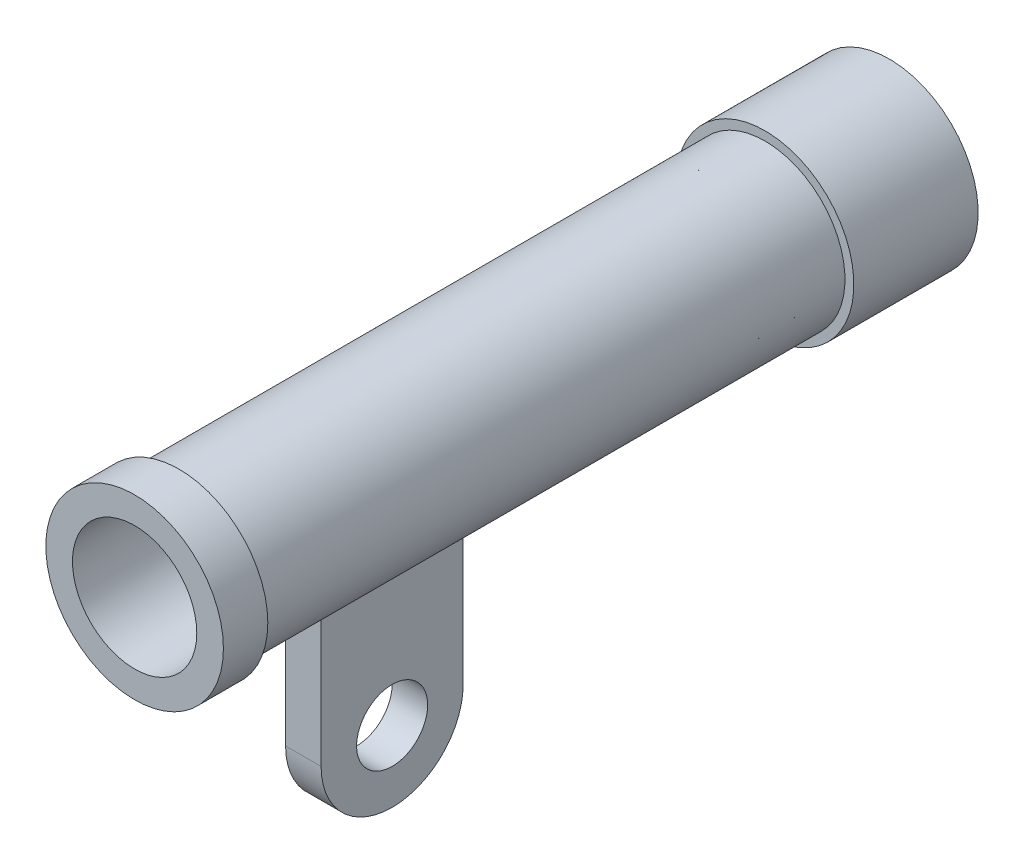
ISO-10303-21;
HEADER;
FILE_DESCRIPTION(('STEP AP214'),'2;1');
FILE_NAME('part.step','',(''),(''),'','','');
FILE_SCHEMA(('AUTOMOTIVE_DESIGN { 1 0 10303 214 1 1 1 1 }'));
ENDSEC;
DATA;
#1=APPLICATION_CONTEXT('core data for automotive mechanical design processes');
#2=APPLICATION_PROTOCOL_DEFINITION('international standard','automotive_design',2000,#1);
#3=PRODUCT_CONTEXT('',#1,'mechanical');
#4=PRODUCT('Part','Part','',(#3));
#5=PRODUCT_RELATED_PRODUCT_CATEGORY('part','',(#4));
#6=PRODUCT_DEFINITION_FORMATION('','',#4);
#7=PRODUCT_DEFINITION_CONTEXT('part definition',#1,'design');
#8=PRODUCT_DEFINITION('design','',#6,#7);
#9=PRODUCT_DEFINITION_SHAPE('','',#8);
#10=(LENGTH_UNIT() NAMED_UNIT(*) SI_UNIT(.MILLI.,.METRE.));
#11=(NAMED_UNIT(*) PLANE_ANGLE_UNIT() SI_UNIT($,.RADIAN.));
#12=(NAMED_UNIT(*) SI_UNIT($,.STERADIAN.) SOLID_ANGLE_UNIT());
#13=UNCERTAINTY_MEASURE_WITH_UNIT(LENGTH_MEASURE(1.E-05),#10,'distance_accuracy_value','');
#14=(GEOMETRIC_REPRESENTATION_CONTEXT(3) GLOBAL_UNCERTAINTY_ASSIGNED_CONTEXT((#13)) GLOBAL_UNIT_ASSIGNED_CONTEXT((#10,
#11,#12)) REPRESENTATION_CONTEXT('',''));
#15=CARTESIAN_POINT('',(0.,0.,0.));
#16=DIRECTION('',(0.,0.,1.));
#17=DIRECTION('',(1.,0.,0.));
#18=AXIS2_PLACEMENT_3D('',#15,#16,#17);
#19=CARTESIAN_POINT('',(10.,-125.,290.));
#20=DIRECTION('',(1.,0.,0.));
#21=DIRECTION('',(0.,0.,-1.));
#22=AXIS2_PLACEMENT_3D('',#19,#20,#21);
#23=PLANE('',#22);
#24=DIRECTION('',(0.,0.,1.));
#25=VECTOR('',#24,1.);
#26=CARTESIAN_POINT('',(10.,-45.,330.));
#27=LINE('',#26,#25);
#28=CARTESIAN_POINT('',(10.,-45.,250.));
#29=VERTEX_POINT('',#28);
#30=CARTESIAN_POINT('',(10.,-45.,330.));
#31=VERTEX_POINT('',#30);
#32=EDGE_CURVE('E92',#29,#31,#27,.T.);
#33=ORIENTED_EDGE('',*,*,#32,.T.);
#34=DIRECTION('',(0.,-1.,0.));
#35=VECTOR('',#34,1.);
#36=CARTESIAN_POINT('',(10.,-45.,330.));
#37=LINE('',#36,#35);
#38=CARTESIAN_POINT('',(10.,-125.,330.));
#39=VERTEX_POINT('',#38);
#40=EDGE_CURVE('E87',#31,#39,#37,.T.);
#41=ORIENTED_EDGE('',*,*,#40,.T.);
#42=CARTESIAN_POINT('',(10.,-125.,290.));
#43=DIRECTION('',(1.,0.,0.));
#44=DIRECTION('',(0.,0.,-1.));
#45=AXIS2_PLACEMENT_3D('',#42,#43,#44);
#46=CIRCLE('',#45,40.);
#47=CARTESIAN_POINT('',(10.,-125.,250.));
#48=VERTEX_POINT('',#47);
#49=EDGE_CURVE('E90',#39,#48,#46,.T.);
#50=ORIENTED_EDGE('',*,*,#49,.T.);
#51=DIRECTION('',(0.,1.,0.));
#52=VECTOR('',#51,1.);
#53=CARTESIAN_POINT('',(10.,-125.,250.));
#54=LINE('',#53,#52);
#55=EDGE_CURVE('E57',#48,#29,#54,.T.);
#56=ORIENTED_EDGE('',*,*,#55,.T.);
#57=EDGE_LOOP('',(#33,#41,#50,#56));
#58=FACE_BOUND('',#57,.T.);
#59=CARTESIAN_POINT('',(10.,-125.,290.));
#60=DIRECTION('',(1.,0.,0.));
#61=DIRECTION('',(0.,0.,-1.));
#62=AXIS2_PLACEMENT_3D('',#59,#60,#61);
#63=CIRCLE('',#62,20.);
#64=CARTESIAN_POINT('',(10.,-125.,270.));
#65=VERTEX_POINT('',#64);
#66=EDGE_CURVE('E107',#65,#65,#63,.T.);
#67=ORIENTED_EDGE('',*,*,#66,.F.);
#68=EDGE_LOOP('',(#67));
#69=FACE_BOUND('',#68,.T.);
#70=ADVANCED_FACE('F40',(#58,#69),#23,.T.);
#71=CARTESIAN_POINT('',(-10.,-125.,290.));
#72=DIRECTION('',(1.,0.,0.));
#73=DIRECTION('',(0.,0.,-1.));
#74=AXIS2_PLACEMENT_3D('',#71,#72,#73);
#75=PLANE('',#74);
#76=DIRECTION('',(0.,0.,1.));
#77=VECTOR('',#76,1.);
#78=CARTESIAN_POINT('',(-10.,-45.,330.));
#79=LINE('',#78,#77);
#80=CARTESIAN_POINT('',(-10.,-45.,250.));
#81=VERTEX_POINT('',#80);
#82=CARTESIAN_POINT('',(-10.,-45.,330.));
#83=VERTEX_POINT('',#82);
#84=EDGE_CURVE('E104',#81,#83,#79,.T.);
#85=ORIENTED_EDGE('',*,*,#84,.F.);
#86=DIRECTION('',(0.,1.,0.));
#87=VECTOR('',#86,1.);
#88=CARTESIAN_POINT('',(-10.,-125.,250.));
#89=LINE('',#88,#87);
#90=CARTESIAN_POINT('',(-10.,-125.,250.));
#91=VERTEX_POINT('',#90);
#92=EDGE_CURVE('E80',#91,#81,#89,.T.);
#93=ORIENTED_EDGE('',*,*,#92,.F.);
#94=CARTESIAN_POINT('',(-10.,-125.,290.));
#95=DIRECTION('',(1.,0.,0.));
#96=DIRECTION('',(0.,0.,-1.));
#97=AXIS2_PLACEMENT_3D('',#94,#95,#96);
#98=CIRCLE('',#97,40.);
#99=CARTESIAN_POINT('',(-10.,-125.,330.));
#100=VERTEX_POINT('',#99);
#101=EDGE_CURVE('E74',#100,#91,#98,.T.);
#102=ORIENTED_EDGE('',*,*,#101,.F.);
#103=DIRECTION('',(0.,-1.,0.));
#104=VECTOR('',#103,1.);
#105=CARTESIAN_POINT('',(-10.,-45.,330.));
#106=LINE('',#105,#104);
#107=EDGE_CURVE('E96',#83,#100,#106,.T.);
#108=ORIENTED_EDGE('',*,*,#107,.F.);
#109=EDGE_LOOP('',(#85,#93,#102,#108));
#110=FACE_BOUND('',#109,.T.);
#111=CARTESIAN_POINT('',(-10.,-125.,290.));
#112=DIRECTION('',(1.,0.,0.));
#113=DIRECTION('',(0.,0.,-1.));
#114=AXIS2_PLACEMENT_3D('',#111,#112,#113);
#115=CIRCLE('',#114,20.);
#116=CARTESIAN_POINT('',(-10.,-125.,270.));
#117=VERTEX_POINT('',#116);
#118=EDGE_CURVE('E119',#117,#117,#115,.T.);
#119=ORIENTED_EDGE('',*,*,#118,.T.);
#120=EDGE_LOOP('',(#119));
#121=FACE_BOUND('',#120,.T.);
#122=ADVANCED_FACE('F115',(#110,#121),#75,.F.);
#123=CARTESIAN_POINT('',(10.,-45.,330.));
#124=DIRECTION('',(0.,-1.,0.));
#125=DIRECTION('',(0.,0.,-1.));
#126=AXIS2_PLACEMENT_3D('',#123,#124,#125);
#127=PLANE('',#126);
#128=ORIENTED_EDGE('',*,*,#84,.T.);
#129=DIRECTION('',(-1.,0.,0.));
#130=VECTOR('',#129,1.);
#131=CARTESIAN_POINT('',(10.,-45.,330.));
#132=LINE('',#131,#130);
#133=EDGE_CURVE('E12',#31,#83,#132,.T.);
#134=ORIENTED_EDGE('',*,*,#133,.F.);
#135=ORIENTED_EDGE('',*,*,#32,.F.);
#136=DIRECTION('',(-1.,0.,0.));
#137=VECTOR('',#136,1.);
#138=CARTESIAN_POINT('',(10.,-45.,250.));
#139=LINE('',#138,#137);
#140=EDGE_CURVE('E100',#29,#81,#139,.T.);
#141=ORIENTED_EDGE('',*,*,#140,.T.);
#142=EDGE_LOOP('',(#128,#134,#135,#141));
#143=FACE_BOUND('',#142,.T.);
#144=ADVANCED_FACE('F42',(#143),#127,.F.);
#145=CARTESIAN_POINT('',(10.,-45.,330.));
#146=DIRECTION('',(0.,0.,-1.));
#147=DIRECTION('',(0.,1.,0.));
#148=AXIS2_PLACEMENT_3D('',#145,#146,#147);
#149=PLANE('',#148);
#150=ORIENTED_EDGE('',*,*,#107,.T.);
#151=DIRECTION('',(-1.,0.,0.));
#152=VECTOR('',#151,1.);
#153=CARTESIAN_POINT('',(10.,-125.,330.));
#154=LINE('',#153,#152);
#155=EDGE_CURVE('E49',#39,#100,#154,.T.);
#156=ORIENTED_EDGE('',*,*,#155,.F.);
#157=ORIENTED_EDGE('',*,*,#40,.F.);
#158=ORIENTED_EDGE('',*,*,#133,.T.);
#159=EDGE_LOOP('',(#150,#156,#157,#158));
#160=FACE_BOUND('',#159,.T.);
#161=ADVANCED_FACE('F95',(#160),#149,.F.);
#162=CARTESIAN_POINT('',(10.,-125.,290.));
#163=DIRECTION('',(-1.,0.,0.));
#164=DIRECTION('',(0.,0.,1.));
#165=AXIS2_PLACEMENT_3D('',#162,#163,#164);
#166=CYLINDRICAL_SURFACE('',#165,40.);
#167=ORIENTED_EDGE('',*,*,#101,.T.);
#168=DIRECTION('',(-1.,0.,0.));
#169=VECTOR('',#168,1.);
#170=CARTESIAN_POINT('',(10.,-125.,250.));
#171=LINE('',#170,#169);
#172=EDGE_CURVE('E97',#48,#91,#171,.T.);
#173=ORIENTED_EDGE('',*,*,#172,.F.);
#174=ORIENTED_EDGE('',*,*,#49,.F.);
#175=ORIENTED_EDGE('',*,*,#155,.T.);
#176=EDGE_LOOP('',(#167,#173,#174,#175));
#177=FACE_BOUND('',#176,.T.);
#178=ADVANCED_FACE('F98',(#177),#166,.T.);
#179=CARTESIAN_POINT('',(10.,-125.,250.));
#180=DIRECTION('',(0.,0.,1.));
#181=DIRECTION('',(1.,0.,0.));
#182=AXIS2_PLACEMENT_3D('',#179,#180,#181);
#183=PLANE('',#182);
#184=ORIENTED_EDGE('',*,*,#92,.T.);
#185=ORIENTED_EDGE('',*,*,#140,.F.);
#186=ORIENTED_EDGE('',*,*,#55,.F.);
#187=ORIENTED_EDGE('',*,*,#172,.T.);
#188=EDGE_LOOP('',(#184,#185,#186,#187));
#189=FACE_BOUND('',#188,.T.);
#190=ADVANCED_FACE('F112',(#189),#183,.F.);
#191=CARTESIAN_POINT('',(10.,-125.,290.));
#192=DIRECTION('',(-1.,0.,0.));
#193=DIRECTION('',(0.,0.,1.));
#194=AXIS2_PLACEMENT_3D('',#191,#192,#193);
#195=CYLINDRICAL_SURFACE('',#194,20.);
#196=ORIENTED_EDGE('',*,*,#66,.T.);
#197=EDGE_LOOP('',(#196));
#198=FACE_BOUND('',#197,.T.);
#199=ORIENTED_EDGE('',*,*,#118,.F.);
#200=EDGE_LOOP('',(#199));
#201=FACE_BOUND('',#200,.T.);
#202=ADVANCED_FACE('F125',(#198,#201),#195,.F.);
#203=CLOSED_SHELL('',(#70,#122,#144,#161,#178,#190,#202));
#204=MANIFOLD_SOLID_BREP('B2',#203);
#205=CARTESIAN_POINT('',(0.,0.,400.));
#206=DIRECTION('',(0.,0.,-1.));
#207=DIRECTION('',(-1.,0.,0.));
#208=AXIS2_PLACEMENT_3D('',#205,#206,#207);
#209=CYLINDRICAL_SURFACE('',#208,45.);
#210=CARTESIAN_POINT('',(0.,0.,400.));
#211=DIRECTION('',(0.,0.,1.));
#212=DIRECTION('',(1.,0.,0.));
#213=AXIS2_PLACEMENT_3D('',#210,#211,#212);
#214=CIRCLE('',#213,45.);
#215=CARTESIAN_POINT('',(45.,0.,400.));
#216=VERTEX_POINT('',#215);
#217=EDGE_CURVE('E195',#216,#216,#214,.T.);
#218=ORIENTED_EDGE('',*,*,#217,.F.);
#219=EDGE_LOOP('',(#218));
#220=FACE_BOUND('',#219,.T.);
#221=CARTESIAN_POINT('',(0.,0.,70.));
#222=DIRECTION('',(0.,0.,-1.));
#223=DIRECTION('',(-1.,0.,0.));
#224=AXIS2_PLACEMENT_3D('',#221,#222,#223);
#225=CIRCLE('',#224,45.);
#226=CARTESIAN_POINT('',(-45.,0.,70.));
#227=VERTEX_POINT('',#226);
#228=EDGE_CURVE('E39',#227,#227,#225,.T.);
#229=ORIENTED_EDGE('',*,*,#228,.F.);
#230=EDGE_LOOP('',(#229));
#231=FACE_BOUND('',#230,.T.);
#232=ADVANCED_FACE('F184',(#220,#231),#209,.T.);
#233=CARTESIAN_POINT('',(0.,0.,70.));
#234=DIRECTION('',(0.,0.,-1.));
#235=DIRECTION('',(-1.,0.,0.));
#236=AXIS2_PLACEMENT_3D('',#233,#234,#235);
#237=PLANE('',#236);
#238=CARTESIAN_POINT('',(0.,0.,70.));
#239=DIRECTION('',(0.,0.,-1.));
#240=DIRECTION('',(-1.,0.,0.));
#241=AXIS2_PLACEMENT_3D('',#238,#239,#240);
#242=CIRCLE('',#241,50.);
#243=CARTESIAN_POINT('',(-50.,0.,70.));
#244=VERTEX_POINT('',#243);
#245=EDGE_CURVE('E200',#244,#244,#242,.T.);
#246=ORIENTED_EDGE('',*,*,#245,.F.);
#247=EDGE_LOOP('',(#246));
#248=FACE_BOUND('',#247,.T.);
#249=ORIENTED_EDGE('',*,*,#228,.T.);
#250=EDGE_LOOP('',(#249));
#251=FACE_BOUND('',#250,.T.);
#252=ADVANCED_FACE('F237',(#248,#251),#237,.F.);
#253=CARTESIAN_POINT('',(0.,0.,70.));
#254=DIRECTION('',(0.,0.,-1.));
#255=DIRECTION('',(-1.,0.,0.));
#256=AXIS2_PLACEMENT_3D('',#253,#254,#255);
#257=CYLINDRICAL_SURFACE('',#256,50.);
#258=ORIENTED_EDGE('',*,*,#245,.T.);
#259=EDGE_LOOP('',(#258));
#260=FACE_BOUND('',#259,.T.);
#261=CARTESIAN_POINT('',(0.,0.,0.));
#262=DIRECTION('',(0.,0.,-1.));
#263=DIRECTION('',(-1.,0.,0.));
#264=AXIS2_PLACEMENT_3D('',#261,#262,#263);
#265=CIRCLE('',#264,50.);
#266=CARTESIAN_POINT('',(-50.,0.,0.));
#267=VERTEX_POINT('',#266);
#268=EDGE_CURVE('E197',#267,#267,#265,.T.);
#269=ORIENTED_EDGE('',*,*,#268,.F.);
#270=EDGE_LOOP('',(#269));
#271=FACE_BOUND('',#270,.T.);
#272=ADVANCED_FACE('F242',(#260,#271),#257,.T.);
#273=CARTESIAN_POINT('',(0.,0.,0.));
#274=DIRECTION('',(0.,0.,1.));
#275=DIRECTION('',(1.,0.,0.));
#276=AXIS2_PLACEMENT_3D('',#273,#274,#275);
#277=PLANE('',#276);
#278=ORIENTED_EDGE('',*,*,#268,.T.);
#279=EDGE_LOOP('',(#278));
#280=FACE_BOUND('',#279,.T.);
#281=ADVANCED_FACE('F233',(#280),#277,.F.);
#282=CARTESIAN_POINT('',(0.,0.,400.));
#283=DIRECTION('',(0.,0.,1.));
#284=DIRECTION('',(1.,0.,0.));
#285=AXIS2_PLACEMENT_3D('',#282,#283,#284);
#286=PLANE('',#285);
#287=CARTESIAN_POINT('',(0.,0.,400.));
#288=DIRECTION('',(0.,0.,1.));
#289=DIRECTION('',(1.,0.,0.));
#290=AXIS2_PLACEMENT_3D('',#287,#288,#289);
#291=CIRCLE('',#290,50.);
#292=CARTESIAN_POINT('',(50.,0.,400.));
#293=VERTEX_POINT('',#292);
#294=EDGE_CURVE('E209',#293,#293,#291,.T.);
#295=ORIENTED_EDGE('',*,*,#294,.F.);
#296=EDGE_LOOP('',(#295));
#297=FACE_BOUND('',#296,.T.);
#298=ORIENTED_EDGE('',*,*,#217,.T.);
#299=EDGE_LOOP('',(#298));
#300=FACE_BOUND('',#299,.T.);
#301=ADVANCED_FACE('F223',(#297,#300),#286,.F.);
#302=CARTESIAN_POINT('',(0.,0.,425.));
#303=DIRECTION('',(0.,0.,1.));
#304=DIRECTION('',(1.,0.,0.));
#305=AXIS2_PLACEMENT_3D('',#302,#303,#304);
#306=PLANE('',#305);
#307=CARTESIAN_POINT('',(0.,0.,425.));
#308=DIRECTION('',(0.,0.,1.));
#309=DIRECTION('',(1.,0.,0.));
#310=AXIS2_PLACEMENT_3D('',#307,#308,#309);
#311=CIRCLE('',#310,50.);
#312=CARTESIAN_POINT('',(50.,0.,425.));
#313=VERTEX_POINT('',#312);
#314=EDGE_CURVE('E207',#313,#313,#311,.T.);
#315=ORIENTED_EDGE('',*,*,#314,.T.);
#316=EDGE_LOOP('',(#315));
#317=FACE_BOUND('',#316,.T.);
#318=CARTESIAN_POINT('',(0.,0.,425.));
#319=DIRECTION('',(0.,0.,1.));
#320=DIRECTION('',(1.,0.,0.));
#321=AXIS2_PLACEMENT_3D('',#318,#319,#320);
#322=CIRCLE('',#321,35.);
#323=CARTESIAN_POINT('',(35.,0.,425.));
#324=VERTEX_POINT('',#323);
#325=EDGE_CURVE('E212',#324,#324,#322,.T.);
#326=ORIENTED_EDGE('',*,*,#325,.F.);
#327=EDGE_LOOP('',(#326));
#328=FACE_BOUND('',#327,.T.);
#329=ADVANCED_FACE('F220',(#317,#328),#306,.T.);
#330=CARTESIAN_POINT('',(0.,0.,425.));
#331=DIRECTION('',(0.,0.,-1.));
#332=DIRECTION('',(-1.,0.,0.));
#333=AXIS2_PLACEMENT_3D('',#330,#331,#332);
#334=CYLINDRICAL_SURFACE('',#333,50.);
#335=ORIENTED_EDGE('',*,*,#314,.F.);
#336=EDGE_LOOP('',(#335));
#337=FACE_BOUND('',#336,.T.);
#338=ORIENTED_EDGE('',*,*,#294,.T.);
#339=EDGE_LOOP('',(#338));
#340=FACE_BOUND('',#339,.T.);
#341=ADVANCED_FACE('F222',(#337,#340),#334,.T.);
#342=CARTESIAN_POINT('',(0.,0.,70.));
#343=DIRECTION('',(0.,0.,-1.));
#344=DIRECTION('',(-1.,0.,0.));
#345=AXIS2_PLACEMENT_3D('',#342,#343,#344);
#346=CIRCLE('',#345,35.);
#347=CARTESIAN_POINT('',(-35.,0.,70.));
#348=VERTEX_POINT('',#347);
#349=EDGE_CURVE('E187',#348,#348,#346,.F.);
#350=ORIENTED_EDGE('',*,*,#349,.T.);
#351=EDGE_LOOP('',(#350));
#352=FACE_BOUND('',#351,.T.);
#353=ADVANCED_FACE('F230',(#352),#237,.F.);
#354=CARTESIAN_POINT('',(0.,0.,50.));
#355=DIRECTION('',(0.,0.,1.));
#356=DIRECTION('',(1.,0.,0.));
#357=AXIS2_PLACEMENT_3D('',#354,#355,#356);
#358=CYLINDRICAL_SURFACE('',#357,35.);
#359=ORIENTED_EDGE('',*,*,#349,.F.);
#360=EDGE_LOOP('',(#359));
#361=FACE_BOUND('',#360,.T.);
#362=ORIENTED_EDGE('',*,*,#325,.T.);
#363=EDGE_LOOP('',(#362));
#364=FACE_BOUND('',#363,.T.);
#365=ADVANCED_FACE('F218',(#361,#364),#358,.F.);
#366=CLOSED_SHELL('',(#232,#252,#272,#281,#301,#329,#341,#353,#365));
#367=MANIFOLD_SOLID_BREP('B6',#366);
#368=ADVANCED_BREP_SHAPE_REPRESENTATION('',(#18,#204,#367),#14);
#369=SHAPE_DEFINITION_REPRESENTATION(#9,#368);
ENDSEC;
END-ISO-10303-21;
